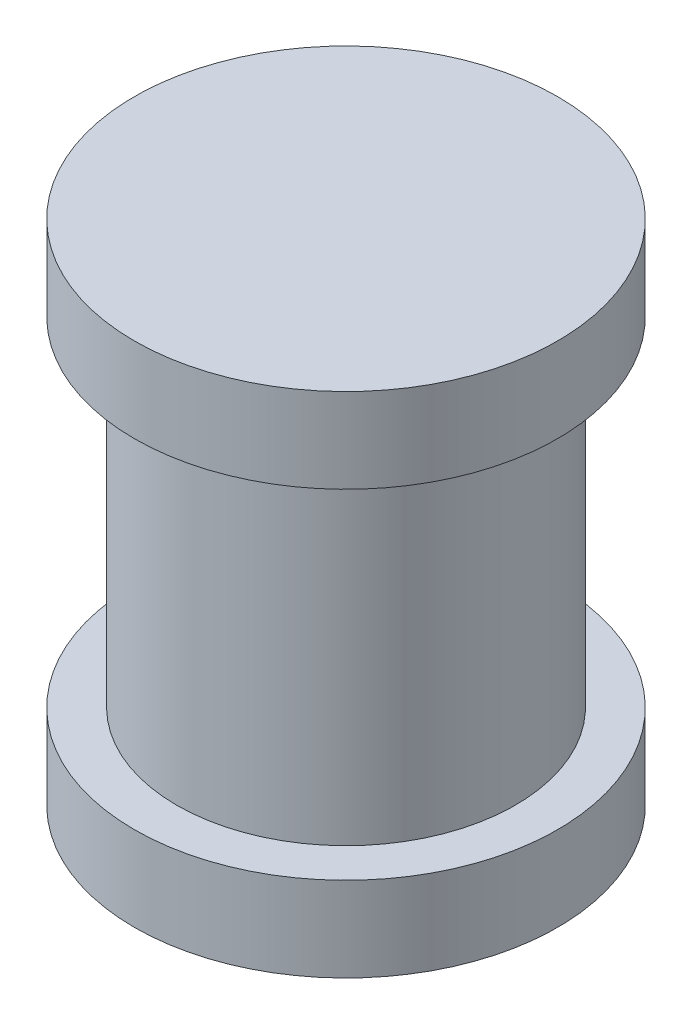
ISO-10303-21;
HEADER;
FILE_DESCRIPTION(('STEP AP214'),'2;1');
FILE_NAME('part.step','',(''),(''),'','','');
FILE_SCHEMA(('AUTOMOTIVE_DESIGN { 1 0 10303 214 1 1 1 1 }'));
ENDSEC;
DATA;
#1=APPLICATION_CONTEXT('core data for automotive mechanical design processes');
#2=APPLICATION_PROTOCOL_DEFINITION('international standard','automotive_design',2000,#1);
#3=PRODUCT_CONTEXT('',#1,'mechanical');
#4=PRODUCT('Part','Part','',(#3));
#5=PRODUCT_RELATED_PRODUCT_CATEGORY('part','',(#4));
#6=PRODUCT_DEFINITION_FORMATION('','',#4);
#7=PRODUCT_DEFINITION_CONTEXT('part definition',#1,'design');
#8=PRODUCT_DEFINITION('design','',#6,#7);
#9=PRODUCT_DEFINITION_SHAPE('','',#8);
#10=(LENGTH_UNIT() NAMED_UNIT(*) SI_UNIT(.MILLI.,.METRE.));
#11=(NAMED_UNIT(*) PLANE_ANGLE_UNIT() SI_UNIT($,.RADIAN.));
#12=(NAMED_UNIT(*) SI_UNIT($,.STERADIAN.) SOLID_ANGLE_UNIT());
#13=UNCERTAINTY_MEASURE_WITH_UNIT(LENGTH_MEASURE(1.E-05),#10,'distance_accuracy_value','');
#14=(GEOMETRIC_REPRESENTATION_CONTEXT(3) GLOBAL_UNCERTAINTY_ASSIGNED_CONTEXT((#13)) GLOBAL_UNIT_ASSIGNED_CONTEXT((#10,
#11,#12)) REPRESENTATION_CONTEXT('',''));
#15=CARTESIAN_POINT('',(0.,0.,0.));
#16=DIRECTION('',(0.,0.,1.));
#17=DIRECTION('',(1.,0.,0.));
#18=AXIS2_PLACEMENT_3D('',#15,#16,#17);
#19=CARTESIAN_POINT('',(0.,1.,0.));
#20=DIRECTION('',(0.,-1.,0.));
#21=DIRECTION('',(0.,0.,-1.));
#22=AXIS2_PLACEMENT_3D('',#19,#20,#21);
#23=CYLINDRICAL_SURFACE('',#22,0.5);
#24=CARTESIAN_POINT('',(0.,1.,0.));
#25=DIRECTION('',(0.,1.,0.));
#26=DIRECTION('',(0.,0.,1.));
#27=AXIS2_PLACEMENT_3D('',#24,#25,#26);
#28=CIRCLE('',#27,0.5);
#29=CARTESIAN_POINT('',(0.,1.,0.5));
#30=VERTEX_POINT('',#29);
#31=EDGE_CURVE('E10',#30,#30,#28,.T.);
#32=ORIENTED_EDGE('',*,*,#31,.F.);
#33=EDGE_LOOP('',(#32));
#34=FACE_BOUND('',#33,.T.);
#35=CARTESIAN_POINT('',(0.,0.,0.));
#36=DIRECTION('',(0.,1.,0.));
#37=DIRECTION('',(0.,0.,1.));
#38=AXIS2_PLACEMENT_3D('',#35,#36,#37);
#39=CIRCLE('',#38,0.5);
#40=CARTESIAN_POINT('',(0.,0.,0.5));
#41=VERTEX_POINT('',#40);
#42=EDGE_CURVE('E40',#41,#41,#39,.T.);
#43=ORIENTED_EDGE('',*,*,#42,.T.);
#44=EDGE_LOOP('',(#43));
#45=FACE_BOUND('',#44,.T.);
#46=ADVANCED_FACE('F37',(#34,#45),#23,.T.);
#47=CARTESIAN_POINT('',(0.,-0.25,0.));
#48=DIRECTION('',(0.,1.,0.));
#49=DIRECTION('',(0.,0.,1.));
#50=AXIS2_PLACEMENT_3D('',#47,#48,#49);
#51=CYLINDRICAL_SURFACE('',#50,0.625);
#52=CARTESIAN_POINT('',(0.,-0.25,0.));
#53=DIRECTION('',(0.,1.,0.));
#54=DIRECTION('',(0.,0.,1.));
#55=AXIS2_PLACEMENT_3D('',#52,#53,#54);
#56=CIRCLE('',#55,0.625);
#57=CARTESIAN_POINT('',(0.,-0.25,0.625));
#58=VERTEX_POINT('',#57);
#59=EDGE_CURVE('E49',#58,#58,#56,.T.);
#60=ORIENTED_EDGE('',*,*,#59,.T.);
#61=EDGE_LOOP('',(#60));
#62=FACE_BOUND('',#61,.T.);
#63=CARTESIAN_POINT('',(0.,0.,0.));
#64=DIRECTION('',(0.,1.,0.));
#65=DIRECTION('',(0.,0.,1.));
#66=AXIS2_PLACEMENT_3D('',#63,#64,#65);
#67=CIRCLE('',#66,0.625);
#68=CARTESIAN_POINT('',(0.,0.,0.625));
#69=VERTEX_POINT('',#68);
#70=EDGE_CURVE('E51',#69,#69,#67,.T.);
#71=ORIENTED_EDGE('',*,*,#70,.F.);
#72=EDGE_LOOP('',(#71));
#73=FACE_BOUND('',#72,.T.);
#74=ADVANCED_FACE('F84',(#62,#73),#51,.T.);
#75=CARTESIAN_POINT('',(0.,-0.25,0.));
#76=DIRECTION('',(0.,1.,0.));
#77=DIRECTION('',(0.,0.,1.));
#78=AXIS2_PLACEMENT_3D('',#75,#76,#77);
#79=PLANE('',#78);
#80=ORIENTED_EDGE('',*,*,#59,.F.);
#81=EDGE_LOOP('',(#80));
#82=FACE_BOUND('',#81,.T.);
#83=ADVANCED_FACE('F89',(#82),#79,.F.);
#84=CARTESIAN_POINT('',(0.,0.,0.));
#85=DIRECTION('',(0.,1.,0.));
#86=DIRECTION('',(0.,0.,1.));
#87=AXIS2_PLACEMENT_3D('',#84,#85,#86);
#88=PLANE('',#87);
#89=ORIENTED_EDGE('',*,*,#42,.F.);
#90=EDGE_LOOP('',(#89));
#91=FACE_BOUND('',#90,.T.);
#92=ORIENTED_EDGE('',*,*,#70,.T.);
#93=EDGE_LOOP('',(#92));
#94=FACE_BOUND('',#93,.T.);
#95=ADVANCED_FACE('F72',(#91,#94),#88,.T.);
#96=CARTESIAN_POINT('',(0.,1.25,0.));
#97=DIRECTION('',(0.,-1.,0.));
#98=DIRECTION('',(0.,0.,-1.));
#99=AXIS2_PLACEMENT_3D('',#96,#97,#98);
#100=CYLINDRICAL_SURFACE('',#99,0.625);
#101=CARTESIAN_POINT('',(0.,1.25,0.));
#102=DIRECTION('',(0.,1.,0.));
#103=DIRECTION('',(0.,0.,1.));
#104=AXIS2_PLACEMENT_3D('',#101,#102,#103);
#105=CIRCLE('',#104,0.625);
#106=CARTESIAN_POINT('',(0.,1.25,0.625));
#107=VERTEX_POINT('',#106);
#108=EDGE_CURVE('E55',#107,#107,#105,.T.);
#109=ORIENTED_EDGE('',*,*,#108,.F.);
#110=EDGE_LOOP('',(#109));
#111=FACE_BOUND('',#110,.T.);
#112=CARTESIAN_POINT('',(0.,1.,0.));
#113=DIRECTION('',(0.,1.,0.));
#114=DIRECTION('',(0.,0.,1.));
#115=AXIS2_PLACEMENT_3D('',#112,#113,#114);
#116=CIRCLE('',#115,0.625);
#117=CARTESIAN_POINT('',(0.,1.,0.625));
#118=VERTEX_POINT('',#117);
#119=EDGE_CURVE('E59',#118,#118,#116,.T.);
#120=ORIENTED_EDGE('',*,*,#119,.T.);
#121=EDGE_LOOP('',(#120));
#122=FACE_BOUND('',#121,.T.);
#123=ADVANCED_FACE('F69',(#111,#122),#100,.T.);
#124=CARTESIAN_POINT('',(0.,1.25,0.));
#125=DIRECTION('',(0.,1.,0.));
#126=DIRECTION('',(0.,0.,1.));
#127=AXIS2_PLACEMENT_3D('',#124,#125,#126);
#128=PLANE('',#127);
#129=ORIENTED_EDGE('',*,*,#108,.T.);
#130=EDGE_LOOP('',(#129));
#131=FACE_BOUND('',#130,.T.);
#132=ADVANCED_FACE('F67',(#131),#128,.T.);
#133=CARTESIAN_POINT('',(0.,1.,0.));
#134=DIRECTION('',(0.,1.,0.));
#135=DIRECTION('',(0.,0.,1.));
#136=AXIS2_PLACEMENT_3D('',#133,#134,#135);
#137=PLANE('',#136);
#138=ORIENTED_EDGE('',*,*,#31,.T.);
#139=EDGE_LOOP('',(#138));
#140=FACE_BOUND('',#139,.T.);
#141=ORIENTED_EDGE('',*,*,#119,.F.);
#142=EDGE_LOOP('',(#141));
#143=FACE_BOUND('',#142,.T.);
#144=ADVANCED_FACE('F76',(#140,#143),#137,.F.);
#145=CLOSED_SHELL('',(#46,#74,#83,#95,#123,#132,#144));
#146=MANIFOLD_SOLID_BREP('B2',#145);
#147=ADVANCED_BREP_SHAPE_REPRESENTATION('',(#18,#146),#14);
#148=SHAPE_DEFINITION_REPRESENTATION(#9,#147);
ENDSEC;
END-ISO-10303-21;
